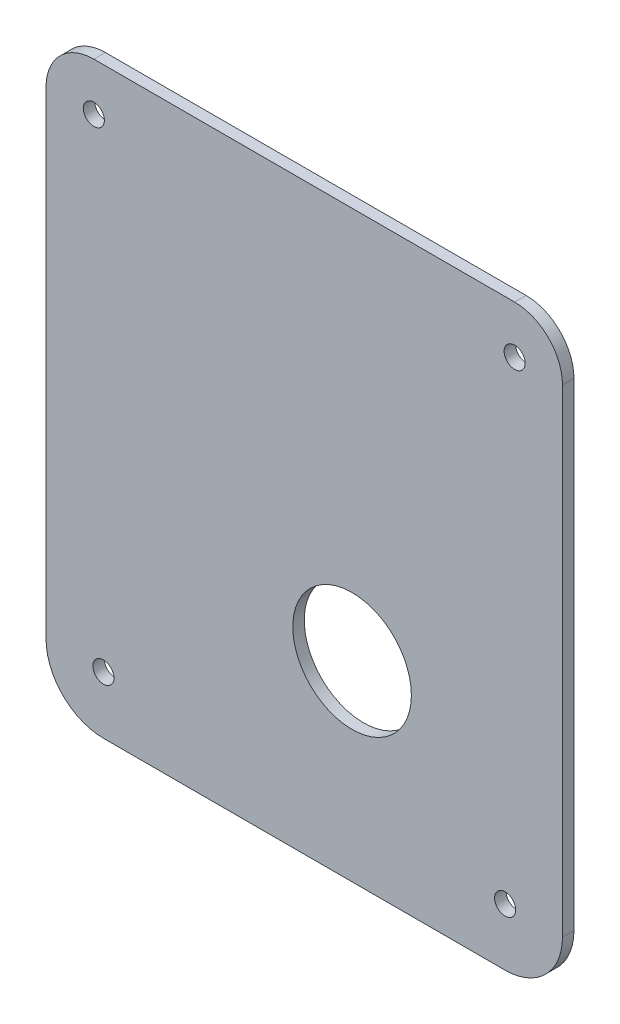
ISO-10303-21;
HEADER;
FILE_DESCRIPTION(('STEP AP214'),'2;1');
FILE_NAME('part.step','',(''),(''),'','','');
FILE_SCHEMA(('AUTOMOTIVE_DESIGN { 1 0 10303 214 1 1 1 1 }'));
ENDSEC;
DATA;
#1=APPLICATION_CONTEXT('core data for automotive mechanical design processes');
#2=APPLICATION_PROTOCOL_DEFINITION('international standard','automotive_design',2000,#1);
#3=PRODUCT_CONTEXT('',#1,'mechanical');
#4=PRODUCT('Part','Part','',(#3));
#5=PRODUCT_RELATED_PRODUCT_CATEGORY('part','',(#4));
#6=PRODUCT_DEFINITION_FORMATION('','',#4);
#7=PRODUCT_DEFINITION_CONTEXT('part definition',#1,'design');
#8=PRODUCT_DEFINITION('design','',#6,#7);
#9=PRODUCT_DEFINITION_SHAPE('','',#8);
#10=(LENGTH_UNIT() NAMED_UNIT(*) SI_UNIT(.MILLI.,.METRE.));
#11=(NAMED_UNIT(*) PLANE_ANGLE_UNIT() SI_UNIT($,.RADIAN.));
#12=(NAMED_UNIT(*) SI_UNIT($,.STERADIAN.) SOLID_ANGLE_UNIT());
#13=UNCERTAINTY_MEASURE_WITH_UNIT(LENGTH_MEASURE(1.E-05),#10,'distance_accuracy_value','');
#14=(GEOMETRIC_REPRESENTATION_CONTEXT(3) GLOBAL_UNCERTAINTY_ASSIGNED_CONTEXT((#13)) GLOBAL_UNIT_ASSIGNED_CONTEXT((#10,
#11,#12)) REPRESENTATION_CONTEXT('',''));
#15=CARTESIAN_POINT('',(0.,0.,0.));
#16=DIRECTION('',(0.,0.,1.));
#17=DIRECTION('',(1.,0.,0.));
#18=AXIS2_PLACEMENT_3D('',#15,#16,#17);
#19=CARTESIAN_POINT('',(42.5,90.,3.));
#20=DIRECTION('',(0.,0.,-1.));
#21=DIRECTION('',(-1.,0.,0.));
#22=AXIS2_PLACEMENT_3D('',#19,#20,#21);
#23=CYLINDRICAL_SURFACE('',#22,12.5);
#24=CARTESIAN_POINT('',(42.5,90.,0.));
#25=DIRECTION('',(0.,0.,1.));
#26=DIRECTION('',(-1.,0.,0.));
#27=AXIS2_PLACEMENT_3D('',#24,#25,#26);
#28=CIRCLE('',#27,12.5);
#29=CARTESIAN_POINT('',(55.,90.,0.));
#30=VERTEX_POINT('',#29);
#31=CARTESIAN_POINT('',(42.5,102.5,0.));
#32=VERTEX_POINT('',#31);
#33=EDGE_CURVE('E135',#30,#32,#28,.T.);
#34=ORIENTED_EDGE('',*,*,#33,.T.);
#35=DIRECTION('',(0.,0.,-1.));
#36=VECTOR('',#35,1.);
#37=CARTESIAN_POINT('',(42.5,102.5,3.));
#38=LINE('',#37,#36);
#39=CARTESIAN_POINT('',(42.5,102.5,3.));
#40=VERTEX_POINT('',#39);
#41=EDGE_CURVE('E11',#40,#32,#38,.T.);
#42=ORIENTED_EDGE('',*,*,#41,.F.);
#43=CARTESIAN_POINT('',(42.5,90.,3.));
#44=DIRECTION('',(0.,0.,1.));
#45=DIRECTION('',(-1.,0.,0.));
#46=AXIS2_PLACEMENT_3D('',#43,#44,#45);
#47=CIRCLE('',#46,12.5);
#48=CARTESIAN_POINT('',(55.,90.,3.));
#49=VERTEX_POINT('',#48);
#50=EDGE_CURVE('E150',#49,#40,#47,.T.);
#51=ORIENTED_EDGE('',*,*,#50,.F.);
#52=DIRECTION('',(0.,0.,-1.));
#53=VECTOR('',#52,1.);
#54=CARTESIAN_POINT('',(55.,90.,3.));
#55=LINE('',#54,#53);
#56=EDGE_CURVE('E131',#49,#30,#55,.T.);
#57=ORIENTED_EDGE('',*,*,#56,.T.);
#58=EDGE_LOOP('',(#34,#42,#51,#57));
#59=FACE_BOUND('',#58,.T.);
#60=ADVANCED_FACE('F39',(#59),#23,.T.);
#61=CARTESIAN_POINT('',(-67.5,102.5,3.));
#62=DIRECTION('',(0.,-1.,0.));
#63=DIRECTION('',(0.,0.,-1.));
#64=AXIS2_PLACEMENT_3D('',#61,#62,#63);
#65=PLANE('',#64);
#66=DIRECTION('',(-1.,0.,0.));
#67=VECTOR('',#66,1.);
#68=CARTESIAN_POINT('',(-67.5,102.5,0.));
#69=LINE('',#68,#67);
#70=CARTESIAN_POINT('',(-67.5,102.5,0.));
#71=VERTEX_POINT('',#70);
#72=EDGE_CURVE('E138',#32,#71,#69,.T.);
#73=ORIENTED_EDGE('',*,*,#72,.T.);
#74=DIRECTION('',(0.,0.,-1.));
#75=VECTOR('',#74,1.);
#76=CARTESIAN_POINT('',(-67.5,102.5,3.));
#77=LINE('',#76,#75);
#78=CARTESIAN_POINT('',(-67.5,102.5,3.));
#79=VERTEX_POINT('',#78);
#80=EDGE_CURVE('E47',#79,#71,#77,.T.);
#81=ORIENTED_EDGE('',*,*,#80,.F.);
#82=DIRECTION('',(-1.,0.,0.));
#83=VECTOR('',#82,1.);
#84=CARTESIAN_POINT('',(-67.5,102.5,3.));
#85=LINE('',#84,#83);
#86=EDGE_CURVE('E98',#40,#79,#85,.T.);
#87=ORIENTED_EDGE('',*,*,#86,.F.);
#88=ORIENTED_EDGE('',*,*,#41,.T.);
#89=EDGE_LOOP('',(#73,#81,#87,#88));
#90=FACE_BOUND('',#89,.T.);
#91=ADVANCED_FACE('F243',(#90),#65,.F.);
#92=CARTESIAN_POINT('',(-67.5,90.,3.));
#93=DIRECTION('',(0.,0.,-1.));
#94=DIRECTION('',(-1.,0.,0.));
#95=AXIS2_PLACEMENT_3D('',#92,#93,#94);
#96=CYLINDRICAL_SURFACE('',#95,12.5);
#97=CARTESIAN_POINT('',(-67.5,90.,0.));
#98=DIRECTION('',(0.,0.,1.));
#99=DIRECTION('',(1.,0.,0.));
#100=AXIS2_PLACEMENT_3D('',#97,#98,#99);
#101=CIRCLE('',#100,12.5);
#102=CARTESIAN_POINT('',(-80.,90.,0.));
#103=VERTEX_POINT('',#102);
#104=EDGE_CURVE('E141',#71,#103,#101,.T.);
#105=ORIENTED_EDGE('',*,*,#104,.T.);
#106=DIRECTION('',(0.,0.,-1.));
#107=VECTOR('',#106,1.);
#108=CARTESIAN_POINT('',(-80.,90.,3.));
#109=LINE('',#108,#107);
#110=CARTESIAN_POINT('',(-80.,90.,3.));
#111=VERTEX_POINT('',#110);
#112=EDGE_CURVE('E157',#111,#103,#109,.T.);
#113=ORIENTED_EDGE('',*,*,#112,.F.);
#114=CARTESIAN_POINT('',(-67.5,90.,3.));
#115=DIRECTION('',(0.,0.,1.));
#116=DIRECTION('',(1.,0.,0.));
#117=AXIS2_PLACEMENT_3D('',#114,#115,#116);
#118=CIRCLE('',#117,12.5);
#119=EDGE_CURVE('E165',#79,#111,#118,.T.);
#120=ORIENTED_EDGE('',*,*,#119,.F.);
#121=ORIENTED_EDGE('',*,*,#80,.T.);
#122=EDGE_LOOP('',(#105,#113,#120,#121));
#123=FACE_BOUND('',#122,.T.);
#124=ADVANCED_FACE('F163',(#123),#96,.T.);
#125=CARTESIAN_POINT('',(-80.,-35.,3.));
#126=DIRECTION('',(1.,0.,0.));
#127=DIRECTION('',(0.,1.,0.));
#128=AXIS2_PLACEMENT_3D('',#125,#126,#127);
#129=PLANE('',#128);
#130=DIRECTION('',(0.,-1.,0.));
#131=VECTOR('',#130,1.);
#132=CARTESIAN_POINT('',(-80.,-35.,0.));
#133=LINE('',#132,#131);
#134=CARTESIAN_POINT('',(-80.,-35.,0.));
#135=VERTEX_POINT('',#134);
#136=EDGE_CURVE('E143',#103,#135,#133,.T.);
#137=ORIENTED_EDGE('',*,*,#136,.T.);
#138=DIRECTION('',(0.,0.,-1.));
#139=VECTOR('',#138,1.);
#140=CARTESIAN_POINT('',(-80.,-35.,3.));
#141=LINE('',#140,#139);
#142=CARTESIAN_POINT('',(-80.,-35.,3.));
#143=VERTEX_POINT('',#142);
#144=EDGE_CURVE('E154',#143,#135,#141,.T.);
#145=ORIENTED_EDGE('',*,*,#144,.F.);
#146=DIRECTION('',(0.,-1.,0.));
#147=VECTOR('',#146,1.);
#148=CARTESIAN_POINT('',(-80.,-35.,3.));
#149=LINE('',#148,#147);
#150=EDGE_CURVE('E177',#111,#143,#149,.T.);
#151=ORIENTED_EDGE('',*,*,#150,.F.);
#152=ORIENTED_EDGE('',*,*,#112,.T.);
#153=EDGE_LOOP('',(#137,#145,#151,#152));
#154=FACE_BOUND('',#153,.T.);
#155=ADVANCED_FACE('F173',(#154),#129,.F.);
#156=CARTESIAN_POINT('',(-65.,-35.,3.));
#157=DIRECTION('',(0.,0.,-1.));
#158=DIRECTION('',(-1.,0.,0.));
#159=AXIS2_PLACEMENT_3D('',#156,#157,#158);
#160=CYLINDRICAL_SURFACE('',#159,15.);
#161=CARTESIAN_POINT('',(-65.,-35.,0.));
#162=DIRECTION('',(0.,0.,1.));
#163=DIRECTION('',(-1.,0.,0.));
#164=AXIS2_PLACEMENT_3D('',#161,#162,#163);
#165=CIRCLE('',#164,15.);
#166=CARTESIAN_POINT('',(-65.,-50.,0.));
#167=VERTEX_POINT('',#166);
#168=EDGE_CURVE('E145',#135,#167,#165,.T.);
#169=ORIENTED_EDGE('',*,*,#168,.T.);
#170=DIRECTION('',(0.,0.,-1.));
#171=VECTOR('',#170,1.);
#172=CARTESIAN_POINT('',(-65.,-50.,3.));
#173=LINE('',#172,#171);
#174=CARTESIAN_POINT('',(-65.,-50.,3.));
#175=VERTEX_POINT('',#174);
#176=EDGE_CURVE('E126',#175,#167,#173,.T.);
#177=ORIENTED_EDGE('',*,*,#176,.F.);
#178=CARTESIAN_POINT('',(-65.,-35.,3.));
#179=DIRECTION('',(0.,0.,1.));
#180=DIRECTION('',(-1.,0.,0.));
#181=AXIS2_PLACEMENT_3D('',#178,#179,#180);
#182=CIRCLE('',#181,15.);
#183=EDGE_CURVE('E117',#143,#175,#182,.T.);
#184=ORIENTED_EDGE('',*,*,#183,.F.);
#185=ORIENTED_EDGE('',*,*,#144,.T.);
#186=EDGE_LOOP('',(#169,#177,#184,#185));
#187=FACE_BOUND('',#186,.T.);
#188=ADVANCED_FACE('F176',(#187),#160,.T.);
#189=CARTESIAN_POINT('',(40.,-50.,3.));
#190=DIRECTION('',(0.,1.,0.));
#191=DIRECTION('',(-1.,0.,0.));
#192=AXIS2_PLACEMENT_3D('',#189,#190,#191);
#193=PLANE('',#192);
#194=DIRECTION('',(1.,0.,0.));
#195=VECTOR('',#194,1.);
#196=CARTESIAN_POINT('',(40.,-50.,0.));
#197=LINE('',#196,#195);
#198=CARTESIAN_POINT('',(40.,-50.,0.));
#199=VERTEX_POINT('',#198);
#200=EDGE_CURVE('E125',#167,#199,#197,.T.);
#201=ORIENTED_EDGE('',*,*,#200,.T.);
#202=DIRECTION('',(0.,0.,-1.));
#203=VECTOR('',#202,1.);
#204=CARTESIAN_POINT('',(40.,-50.,3.));
#205=LINE('',#204,#203);
#206=CARTESIAN_POINT('',(40.,-50.,3.));
#207=VERTEX_POINT('',#206);
#208=EDGE_CURVE('E122',#207,#199,#205,.T.);
#209=ORIENTED_EDGE('',*,*,#208,.F.);
#210=DIRECTION('',(1.,0.,0.));
#211=VECTOR('',#210,1.);
#212=CARTESIAN_POINT('',(40.,-50.,3.));
#213=LINE('',#212,#211);
#214=EDGE_CURVE('E111',#175,#207,#213,.T.);
#215=ORIENTED_EDGE('',*,*,#214,.F.);
#216=ORIENTED_EDGE('',*,*,#176,.T.);
#217=EDGE_LOOP('',(#201,#209,#215,#216));
#218=FACE_BOUND('',#217,.T.);
#219=ADVANCED_FACE('F123',(#218),#193,.F.);
#220=CARTESIAN_POINT('',(40.,-35.,3.));
#221=DIRECTION('',(0.,0.,-1.));
#222=DIRECTION('',(-1.,0.,0.));
#223=AXIS2_PLACEMENT_3D('',#220,#221,#222);
#224=CYLINDRICAL_SURFACE('',#223,15.);
#225=CARTESIAN_POINT('',(40.,-35.,0.));
#226=DIRECTION('',(0.,0.,1.));
#227=DIRECTION('',(-1.,0.,0.));
#228=AXIS2_PLACEMENT_3D('',#225,#226,#227);
#229=CIRCLE('',#228,15.);
#230=CARTESIAN_POINT('',(55.,-35.,0.));
#231=VERTEX_POINT('',#230);
#232=EDGE_CURVE('E84',#199,#231,#229,.T.);
#233=ORIENTED_EDGE('',*,*,#232,.T.);
#234=DIRECTION('',(0.,0.,-1.));
#235=VECTOR('',#234,1.);
#236=CARTESIAN_POINT('',(55.,-35.,3.));
#237=LINE('',#236,#235);
#238=CARTESIAN_POINT('',(55.,-35.,3.));
#239=VERTEX_POINT('',#238);
#240=EDGE_CURVE('E127',#239,#231,#237,.T.);
#241=ORIENTED_EDGE('',*,*,#240,.F.);
#242=CARTESIAN_POINT('',(40.,-35.,3.));
#243=DIRECTION('',(0.,0.,1.));
#244=DIRECTION('',(-1.,0.,0.));
#245=AXIS2_PLACEMENT_3D('',#242,#243,#244);
#246=CIRCLE('',#245,15.);
#247=EDGE_CURVE('E115',#207,#239,#246,.T.);
#248=ORIENTED_EDGE('',*,*,#247,.F.);
#249=ORIENTED_EDGE('',*,*,#208,.T.);
#250=EDGE_LOOP('',(#233,#241,#248,#249));
#251=FACE_BOUND('',#250,.T.);
#252=ADVANCED_FACE('F129',(#251),#224,.T.);
#253=CARTESIAN_POINT('',(55.,90.,3.));
#254=DIRECTION('',(-1.,0.,0.));
#255=DIRECTION('',(0.,-1.,0.));
#256=AXIS2_PLACEMENT_3D('',#253,#254,#255);
#257=PLANE('',#256);
#258=DIRECTION('',(0.,1.,0.));
#259=VECTOR('',#258,1.);
#260=CARTESIAN_POINT('',(55.,90.,0.));
#261=LINE('',#260,#259);
#262=EDGE_CURVE('E90',#231,#30,#261,.T.);
#263=ORIENTED_EDGE('',*,*,#262,.T.);
#264=ORIENTED_EDGE('',*,*,#56,.F.);
#265=DIRECTION('',(0.,1.,0.));
#266=VECTOR('',#265,1.);
#267=CARTESIAN_POINT('',(55.,90.,3.));
#268=LINE('',#267,#266);
#269=EDGE_CURVE('E55',#239,#49,#268,.T.);
#270=ORIENTED_EDGE('',*,*,#269,.F.);
#271=ORIENTED_EDGE('',*,*,#240,.T.);
#272=EDGE_LOOP('',(#263,#264,#270,#271));
#273=FACE_BOUND('',#272,.T.);
#274=ADVANCED_FACE('F234',(#273),#257,.F.);
#275=CARTESIAN_POINT('',(42.5,90.,3.));
#276=DIRECTION('',(0.,0.,-1.));
#277=DIRECTION('',(-1.,0.,0.));
#278=AXIS2_PLACEMENT_3D('',#275,#276,#277);
#279=PLANE('',#278);
#280=CARTESIAN_POINT('',(40.,-35.,3.));
#281=DIRECTION('',(0.,0.,-1.));
#282=DIRECTION('',(-1.,0.,0.));
#283=AXIS2_PLACEMENT_3D('',#280,#281,#282);
#284=CIRCLE('',#283,2.75);
#285=CARTESIAN_POINT('',(37.25,-35.,3.));
#286=VERTEX_POINT('',#285);
#287=EDGE_CURVE('E206',#286,#286,#284,.T.);
#288=ORIENTED_EDGE('',*,*,#287,.T.);
#289=EDGE_LOOP('',(#288));
#290=FACE_BOUND('',#289,.T.);
#291=CARTESIAN_POINT('',(-67.5,90.,3.));
#292=DIRECTION('',(0.,0.,-1.));
#293=DIRECTION('',(-1.,0.,0.));
#294=AXIS2_PLACEMENT_3D('',#291,#292,#293);
#295=CIRCLE('',#294,2.75);
#296=CARTESIAN_POINT('',(-70.25,90.,3.));
#297=VERTEX_POINT('',#296);
#298=EDGE_CURVE('E200',#297,#297,#295,.T.);
#299=ORIENTED_EDGE('',*,*,#298,.T.);
#300=EDGE_LOOP('',(#299));
#301=FACE_BOUND('',#300,.T.);
#302=CARTESIAN_POINT('',(-65.,-35.,3.));
#303=DIRECTION('',(0.,0.,-1.));
#304=DIRECTION('',(-1.,0.,0.));
#305=AXIS2_PLACEMENT_3D('',#302,#303,#304);
#306=CIRCLE('',#305,2.75);
#307=CARTESIAN_POINT('',(-67.75,-35.,3.));
#308=VERTEX_POINT('',#307);
#309=EDGE_CURVE('E194',#308,#308,#306,.T.);
#310=ORIENTED_EDGE('',*,*,#309,.T.);
#311=EDGE_LOOP('',(#310));
#312=FACE_BOUND('',#311,.T.);
#313=CARTESIAN_POINT('',(42.5,90.,3.));
#314=DIRECTION('',(0.,0.,-1.));
#315=DIRECTION('',(-1.,0.,0.));
#316=AXIS2_PLACEMENT_3D('',#313,#314,#315);
#317=CIRCLE('',#316,2.75);
#318=CARTESIAN_POINT('',(39.75,90.,3.));
#319=VERTEX_POINT('',#318);
#320=EDGE_CURVE('E186',#319,#319,#317,.T.);
#321=ORIENTED_EDGE('',*,*,#320,.T.);
#322=EDGE_LOOP('',(#321));
#323=FACE_BOUND('',#322,.T.);
#324=CARTESIAN_POINT('',(0.,0.,3.));
#325=DIRECTION('',(0.,0.,1.));
#326=DIRECTION('',(1.,0.,0.));
#327=AXIS2_PLACEMENT_3D('',#324,#325,#326);
#328=CIRCLE('',#327,15.5);
#329=CARTESIAN_POINT('',(15.5,0.,3.));
#330=VERTEX_POINT('',#329);
#331=EDGE_CURVE('E183',#330,#330,#328,.T.);
#332=ORIENTED_EDGE('',*,*,#331,.F.);
#333=EDGE_LOOP('',(#332));
#334=FACE_BOUND('',#333,.T.);
#335=ORIENTED_EDGE('',*,*,#50,.T.);
#336=ORIENTED_EDGE('',*,*,#86,.T.);
#337=ORIENTED_EDGE('',*,*,#119,.T.);
#338=ORIENTED_EDGE('',*,*,#150,.T.);
#339=ORIENTED_EDGE('',*,*,#183,.T.);
#340=ORIENTED_EDGE('',*,*,#214,.T.);
#341=ORIENTED_EDGE('',*,*,#247,.T.);
#342=ORIENTED_EDGE('',*,*,#269,.T.);
#343=EDGE_LOOP('',(#335,#336,#337,#338,#339,#340,#341,#342));
#344=FACE_BOUND('',#343,.T.);
#345=ADVANCED_FACE('F113',(#290,#301,#312,#323,#334,#344),#279,.F.);
#346=CARTESIAN_POINT('',(42.5,90.,0.));
#347=DIRECTION('',(0.,0.,-1.));
#348=DIRECTION('',(-1.,0.,0.));
#349=AXIS2_PLACEMENT_3D('',#346,#347,#348);
#350=PLANE('',#349);
#351=CARTESIAN_POINT('',(40.,-35.,0.));
#352=DIRECTION('',(0.,0.,-1.));
#353=DIRECTION('',(-1.,0.,0.));
#354=AXIS2_PLACEMENT_3D('',#351,#352,#353);
#355=CIRCLE('',#354,2.74999999999999);
#356=CARTESIAN_POINT('',(37.25,-35.,0.));
#357=VERTEX_POINT('',#356);
#358=EDGE_CURVE('E209',#357,#357,#355,.T.);
#359=ORIENTED_EDGE('',*,*,#358,.F.);
#360=EDGE_LOOP('',(#359));
#361=FACE_BOUND('',#360,.T.);
#362=CARTESIAN_POINT('',(-67.5,90.,0.));
#363=DIRECTION('',(0.,0.,-1.));
#364=DIRECTION('',(-1.,0.,0.));
#365=AXIS2_PLACEMENT_3D('',#362,#363,#364);
#366=CIRCLE('',#365,2.74999999999999);
#367=CARTESIAN_POINT('',(-70.25,90.,0.));
#368=VERTEX_POINT('',#367);
#369=EDGE_CURVE('E203',#368,#368,#366,.T.);
#370=ORIENTED_EDGE('',*,*,#369,.F.);
#371=EDGE_LOOP('',(#370));
#372=FACE_BOUND('',#371,.T.);
#373=CARTESIAN_POINT('',(-65.,-35.,0.));
#374=DIRECTION('',(0.,0.,-1.));
#375=DIRECTION('',(-1.,0.,0.));
#376=AXIS2_PLACEMENT_3D('',#373,#374,#375);
#377=CIRCLE('',#376,2.74999999999999);
#378=CARTESIAN_POINT('',(-67.75,-35.,0.));
#379=VERTEX_POINT('',#378);
#380=EDGE_CURVE('E197',#379,#379,#377,.T.);
#381=ORIENTED_EDGE('',*,*,#380,.F.);
#382=EDGE_LOOP('',(#381));
#383=FACE_BOUND('',#382,.T.);
#384=CARTESIAN_POINT('',(42.5,90.,0.));
#385=DIRECTION('',(0.,0.,-1.));
#386=DIRECTION('',(-1.,0.,0.));
#387=AXIS2_PLACEMENT_3D('',#384,#385,#386);
#388=CIRCLE('',#387,2.74999999999999);
#389=CARTESIAN_POINT('',(39.75,90.,0.));
#390=VERTEX_POINT('',#389);
#391=EDGE_CURVE('E191',#390,#390,#388,.T.);
#392=ORIENTED_EDGE('',*,*,#391,.F.);
#393=EDGE_LOOP('',(#392));
#394=FACE_BOUND('',#393,.T.);
#395=CARTESIAN_POINT('',(0.,0.,0.));
#396=DIRECTION('',(0.,0.,1.));
#397=DIRECTION('',(1.,0.,0.));
#398=AXIS2_PLACEMENT_3D('',#395,#396,#397);
#399=CIRCLE('',#398,15.5);
#400=CARTESIAN_POINT('',(15.5,0.,0.));
#401=VERTEX_POINT('',#400);
#402=EDGE_CURVE('E139',#401,#401,#399,.T.);
#403=ORIENTED_EDGE('',*,*,#402,.T.);
#404=EDGE_LOOP('',(#403));
#405=FACE_BOUND('',#404,.T.);
#406=ORIENTED_EDGE('',*,*,#33,.F.);
#407=ORIENTED_EDGE('',*,*,#262,.F.);
#408=ORIENTED_EDGE('',*,*,#232,.F.);
#409=ORIENTED_EDGE('',*,*,#200,.F.);
#410=ORIENTED_EDGE('',*,*,#168,.F.);
#411=ORIENTED_EDGE('',*,*,#136,.F.);
#412=ORIENTED_EDGE('',*,*,#104,.F.);
#413=ORIENTED_EDGE('',*,*,#72,.F.);
#414=EDGE_LOOP('',(#406,#407,#408,#409,#410,#411,#412,#413));
#415=FACE_BOUND('',#414,.T.);
#416=ADVANCED_FACE('F169',(#361,#372,#383,#394,#405,#415),#350,.T.);
#417=CARTESIAN_POINT('',(0.,0.,0.));
#418=DIRECTION('',(0.,0.,1.));
#419=DIRECTION('',(1.,0.,0.));
#420=AXIS2_PLACEMENT_3D('',#417,#418,#419);
#421=CYLINDRICAL_SURFACE('',#420,15.5);
#422=ORIENTED_EDGE('',*,*,#402,.F.);
#423=EDGE_LOOP('',(#422));
#424=FACE_BOUND('',#423,.T.);
#425=ORIENTED_EDGE('',*,*,#331,.T.);
#426=EDGE_LOOP('',(#425));
#427=FACE_BOUND('',#426,.T.);
#428=ADVANCED_FACE('F217',(#424,#427),#421,.F.);
#429=CARTESIAN_POINT('',(42.5,90.,0.));
#430=DIRECTION('',(0.,0.,-1.));
#431=DIRECTION('',(-1.,0.,0.));
#432=AXIS2_PLACEMENT_3D('',#429,#430,#431);
#433=CYLINDRICAL_SURFACE('',#432,2.75);
#434=ORIENTED_EDGE('',*,*,#320,.F.);
#435=EDGE_LOOP('',(#434));
#436=FACE_BOUND('',#435,.T.);
#437=ORIENTED_EDGE('',*,*,#391,.T.);
#438=EDGE_LOOP('',(#437));
#439=FACE_BOUND('',#438,.T.);
#440=ADVANCED_FACE('F229',(#436,#439),#433,.F.);
#441=CARTESIAN_POINT('',(-65.,-35.,0.));
#442=DIRECTION('',(0.,0.,-1.));
#443=DIRECTION('',(-1.,0.,0.));
#444=AXIS2_PLACEMENT_3D('',#441,#442,#443);
#445=CYLINDRICAL_SURFACE('',#444,2.75);
#446=ORIENTED_EDGE('',*,*,#309,.F.);
#447=EDGE_LOOP('',(#446));
#448=FACE_BOUND('',#447,.T.);
#449=ORIENTED_EDGE('',*,*,#380,.T.);
#450=EDGE_LOOP('',(#449));
#451=FACE_BOUND('',#450,.T.);
#452=ADVANCED_FACE('F299',(#448,#451),#445,.F.);
#453=CARTESIAN_POINT('',(-67.5,90.,0.));
#454=DIRECTION('',(0.,0.,-1.));
#455=DIRECTION('',(-1.,0.,0.));
#456=AXIS2_PLACEMENT_3D('',#453,#454,#455);
#457=CYLINDRICAL_SURFACE('',#456,2.75);
#458=ORIENTED_EDGE('',*,*,#298,.F.);
#459=EDGE_LOOP('',(#458));
#460=FACE_BOUND('',#459,.T.);
#461=ORIENTED_EDGE('',*,*,#369,.T.);
#462=EDGE_LOOP('',(#461));
#463=FACE_BOUND('',#462,.T.);
#464=ADVANCED_FACE('F309',(#460,#463),#457,.F.);
#465=CARTESIAN_POINT('',(40.,-35.,0.));
#466=DIRECTION('',(0.,0.,-1.));
#467=DIRECTION('',(-1.,0.,0.));
#468=AXIS2_PLACEMENT_3D('',#465,#466,#467);
#469=CYLINDRICAL_SURFACE('',#468,2.75);
#470=ORIENTED_EDGE('',*,*,#287,.F.);
#471=EDGE_LOOP('',(#470));
#472=FACE_BOUND('',#471,.T.);
#473=ORIENTED_EDGE('',*,*,#358,.T.);
#474=EDGE_LOOP('',(#473));
#475=FACE_BOUND('',#474,.T.);
#476=ADVANCED_FACE('F213',(#472,#475),#469,.F.);
#477=CLOSED_SHELL('',(#60,#91,#124,#155,#188,#219,#252,#274,#345,#416,#428,#440,#452,#464,#476));
#478=MANIFOLD_SOLID_BREP('B2',#477);
#479=ADVANCED_BREP_SHAPE_REPRESENTATION('',(#18,#478),#14);
#480=SHAPE_DEFINITION_REPRESENTATION(#9,#479);
ENDSEC;
END-ISO-10303-21;
